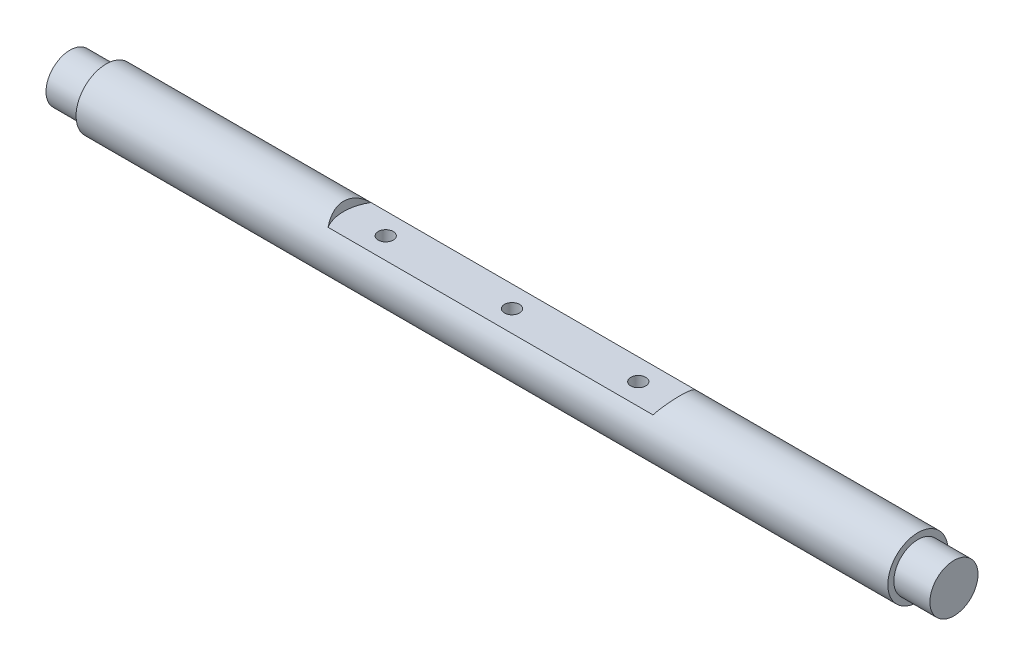
ISO-10303-21;
HEADER;
FILE_DESCRIPTION(('STEP AP214'),'2;1');
FILE_NAME('part.step','',(''),(''),'','','');
FILE_SCHEMA(('AUTOMOTIVE_DESIGN { 1 0 10303 214 1 1 1 1 }'));
ENDSEC;
DATA;
#1=APPLICATION_CONTEXT('core data for automotive mechanical design processes');
#2=APPLICATION_PROTOCOL_DEFINITION('international standard','automotive_design',2000,#1);
#3=PRODUCT_CONTEXT('',#1,'mechanical');
#4=PRODUCT('Part','Part','',(#3));
#5=PRODUCT_RELATED_PRODUCT_CATEGORY('part','',(#4));
#6=PRODUCT_DEFINITION_FORMATION('','',#4);
#7=PRODUCT_DEFINITION_CONTEXT('part definition',#1,'design');
#8=PRODUCT_DEFINITION('design','',#6,#7);
#9=PRODUCT_DEFINITION_SHAPE('','',#8);
#10=(LENGTH_UNIT() NAMED_UNIT(*) SI_UNIT(.MILLI.,.METRE.));
#11=(NAMED_UNIT(*) PLANE_ANGLE_UNIT() SI_UNIT($,.RADIAN.));
#12=(NAMED_UNIT(*) SI_UNIT($,.STERADIAN.) SOLID_ANGLE_UNIT());
#13=UNCERTAINTY_MEASURE_WITH_UNIT(LENGTH_MEASURE(1.E-05),#10,'distance_accuracy_value','');
#14=(GEOMETRIC_REPRESENTATION_CONTEXT(3) GLOBAL_UNCERTAINTY_ASSIGNED_CONTEXT((#13)) GLOBAL_UNIT_ASSIGNED_CONTEXT((#10,
#11,#12)) REPRESENTATION_CONTEXT('',''));
#15=CARTESIAN_POINT('',(0.,0.,0.));
#16=DIRECTION('',(0.,0.,1.));
#17=DIRECTION('',(1.,0.,0.));
#18=AXIS2_PLACEMENT_3D('',#15,#16,#17);
#19=CARTESIAN_POINT('',(-73.5,0.,0.));
#20=DIRECTION('',(1.,0.,0.));
#21=DIRECTION('',(0.,1.,0.));
#22=AXIS2_PLACEMENT_3D('',#19,#20,#21);
#23=CYLINDRICAL_SURFACE('',#22,4.99999999999999);
#24=CARTESIAN_POINT('',(67.5,0.,0.));
#25=DIRECTION('',(1.,0.,0.));
#26=DIRECTION('',(0.,1.,0.));
#27=AXIS2_PLACEMENT_3D('',#24,#25,#26);
#28=CIRCLE('',#27,4.99999999999998);
#29=CARTESIAN_POINT('',(67.5,5.,0.));
#30=VERTEX_POINT('',#29);
#31=EDGE_CURVE('E90',#30,#30,#28,.T.);
#32=ORIENTED_EDGE('',*,*,#31,.F.);
#33=EDGE_LOOP('',(#32));
#34=FACE_BOUND('',#33,.T.);
#35=CARTESIAN_POINT('',(-67.5,0.,0.));
#36=DIRECTION('',(1.,0.,0.));
#37=DIRECTION('',(0.,1.,0.));
#38=AXIS2_PLACEMENT_3D('',#35,#36,#37);
#39=CIRCLE('',#38,5.);
#40=CARTESIAN_POINT('',(-67.5,5.,0.));
#41=VERTEX_POINT('',#40);
#42=EDGE_CURVE('E93',#41,#41,#39,.T.);
#43=ORIENTED_EDGE('',*,*,#42,.T.);
#44=EDGE_LOOP('',(#43));
#45=FACE_BOUND('',#44,.T.);
#46=CARTESIAN_POINT('',(-21.,-4.84122918275926,1.25));
#47=CARTESIAN_POINT('',(-21.0690253754623,-4.84123050042653,1.24999803929589));
#48=CARTESIAN_POINT('',(-21.138072449339,-4.84272153006955,1.24426312274865));
#49=CARTESIAN_POINT('',(-21.274183789087,-4.84850930996623,1.22151156273207));
#50=CARTESIAN_POINT('',(-21.3412468772342,-4.85280769310905,1.2044883533711));
#51=CARTESIAN_POINT('',(-21.4714017690935,-4.86369362297982,1.15974559981597));
#52=CARTESIAN_POINT('',(-21.5344985776928,-4.87027821345203,1.13203986392723));
#53=CARTESIAN_POINT('',(-21.65515542627,-4.88499096014402,1.0667605706307));
#54=CARTESIAN_POINT('',(-21.7127152310401,-4.89311918189249,1.02918659428034));
#55=CARTESIAN_POINT('',(-21.8219308226311,-4.91020358177804,0.944354213655933));
#56=CARTESIAN_POINT('',(-21.873446800175,-4.91917298811514,0.896918443852021));
#57=CARTESIAN_POINT('',(-21.9678806971802,-4.93681437757647,0.794091032050329));
#58=CARTESIAN_POINT('',(-22.0107978128109,-4.94548633283193,0.73869864709015));
#59=CARTESIAN_POINT('',(-22.0873877338156,-4.96170207760289,0.620572600539473));
#60=CARTESIAN_POINT('',(-22.1209231940807,-4.96922843700295,0.557747288097556));
#61=CARTESIAN_POINT('',(-22.1769048220765,-4.9821540596299,0.427131592146378));
#62=CARTESIAN_POINT('',(-22.1993526259578,-4.98755363667171,0.359341942895967));
#63=CARTESIAN_POINT('',(-22.2320739172893,-4.99552379424088,0.222179379377078));
#64=CARTESIAN_POINT('',(-22.2425848221633,-4.99814946922155,0.152866359774485));
#65=CARTESIAN_POINT('',(-22.2518791896378,-5.00046797053647,0.0134144096313823));
#66=CARTESIAN_POINT('',(-22.2506643861048,-5.0001612304835,-0.0567243972690367));
#67=CARTESIAN_POINT('',(-22.2367125748749,-4.99669047476766,-0.194190308965486));
#68=CARTESIAN_POINT('',(-22.2242318374731,-4.99359001170435,-0.261545269501336));
#69=CARTESIAN_POINT('',(-22.1885143649757,-4.98495418262425,-0.39317280926711));
#70=CARTESIAN_POINT('',(-22.1652770573113,-4.97941868699219,-0.457445224213049));
#71=CARTESIAN_POINT('',(-22.1084987146565,-4.96643754850446,-0.58175837937726));
#72=CARTESIAN_POINT('',(-22.0748664776691,-4.95897509847525,-0.641755637208133));
#73=CARTESIAN_POINT('',(-21.9983221604419,-4.94294951904823,-0.755344527925614));
#74=CARTESIAN_POINT('',(-21.9554084657197,-4.93438619826243,-0.808935043856884));
#75=CARTESIAN_POINT('',(-21.8601456290088,-4.91681856884759,-0.909717543856196));
#76=CARTESIAN_POINT('',(-21.8075725538261,-4.90780859762957,-0.956697098843999));
#77=CARTESIAN_POINT('',(-21.6952000132299,-4.89057521758352,-1.04122046995377));
#78=CARTESIAN_POINT('',(-21.6354002102545,-4.88235184552984,-1.07876384505752));
#79=CARTESIAN_POINT('',(-21.5098549829255,-4.86760248415823,-1.14348516127825));
#80=CARTESIAN_POINT('',(-21.4440821348434,-4.86108491862859,-1.17061195871311));
#81=CARTESIAN_POINT('',(-21.3087072659618,-4.85059320069977,-1.21335702579542));
#82=CARTESIAN_POINT('',(-21.2391060680084,-4.84661850405108,-1.22897775819114));
#83=CARTESIAN_POINT('',(-21.1000202492384,-4.84177678019569,-1.24791481933259));
#84=CARTESIAN_POINT('',(-21.0305811033352,-4.84083044546822,-1.25154523695981));
#85=CARTESIAN_POINT('',(-20.8920890317109,-4.84193671740518,-1.24725849525777));
#86=CARTESIAN_POINT('',(-20.8230360710244,-4.84398904800631,-1.2393423989244));
#87=CARTESIAN_POINT('',(-20.6884428675226,-4.85078540977279,-1.21246273196883));
#88=CARTESIAN_POINT('',(-20.6228636367146,-4.85548485117186,-1.19368203414087));
#89=CARTESIAN_POINT('',(-20.4957842710742,-4.8670035913548,-1.14580904083531));
#90=CARTESIAN_POINT('',(-20.4342846204723,-4.87382314124305,-1.11671552385627));
#91=CARTESIAN_POINT('',(-20.3157793610663,-4.8889806854663,-1.04838533396827));
#92=CARTESIAN_POINT('',(-20.2588855799785,-4.89734584303319,-1.00896087691781));
#93=CARTESIAN_POINT('',(-20.1524058185993,-4.91458541535856,-0.921325366168066));
#94=CARTESIAN_POINT('',(-20.102821041675,-4.92345991364233,-0.873112868506796));
#95=CARTESIAN_POINT('',(-20.0110944787145,-4.94098701515801,-0.767828401230903));
#96=CARTESIAN_POINT('',(-19.9691699687256,-4.94962851030916,-0.710564940664485));
#97=CARTESIAN_POINT('',(-19.8955320665244,-4.96548608306865,-0.589628353368338));
#98=CARTESIAN_POINT('',(-19.8638181416959,-4.97270223501978,-0.525955561196984));
#99=CARTESIAN_POINT('',(-19.811776982736,-4.98485057869155,-0.394447752163859));
#100=CARTESIAN_POINT('',(-19.7913678578105,-4.98979915011203,-0.326646726284848));
#101=CARTESIAN_POINT('',(-19.7622698326958,-4.99692646697892,-0.188437200398506));
#102=CARTESIAN_POINT('',(-19.7535786706305,-4.99910574696703,-0.118029206301551));
#103=CARTESIAN_POINT('',(-19.7482905130306,-5.00042711761012,0.021354408054161));
#104=CARTESIAN_POINT('',(-19.7513728636308,-4.99964973600009,0.0903172837075443));
#105=CARTESIAN_POINT('',(-19.7688097841179,-4.99532370571778,0.226709370518427));
#106=CARTESIAN_POINT('',(-19.7831640187664,-4.99177513946367,0.294138627226111));
#107=CARTESIAN_POINT('',(-19.8225652747137,-4.98231791067452,0.425213794556022));
#108=CARTESIAN_POINT('',(-19.8475543166433,-4.97642205628331,0.488878118226276));
#109=CARTESIAN_POINT('',(-19.9074632237742,-4.96289111141729,0.611146316301837));
#110=CARTESIAN_POINT('',(-19.942384340837,-4.95525580172168,0.669749551581316));
#111=CARTESIAN_POINT('',(-20.0221440424963,-4.93884062101664,0.781752410529876));
#112=CARTESIAN_POINT('',(-20.0672001786342,-4.93003771182012,0.834993735375732));
#113=CARTESIAN_POINT('',(-20.1655285649673,-4.91238311316551,0.93326877533907));
#114=CARTESIAN_POINT('',(-20.2188028951224,-4.90353141190693,0.978300406335238));
#115=CARTESIAN_POINT('',(-20.3332517677517,-4.88659344825683,1.05970253309904));
#116=CARTESIAN_POINT('',(-20.3945551542658,-4.87852454662354,1.09589577430819));
#117=CARTESIAN_POINT('',(-20.5225693624034,-4.86429944438268,1.15740862076958));
#118=CARTESIAN_POINT('',(-20.5892762076334,-4.85814185308377,1.18273613719965));
#119=CARTESIAN_POINT('',(-20.7132212647834,-4.84939885924727,1.2180281607068));
#120=CARTESIAN_POINT('',(-20.7698664554798,-4.84635828750682,1.22999146324422));
#121=CARTESIAN_POINT('',(-20.88433608625,-4.84227298231963,1.24597786571658));
#122=CARTESIAN_POINT('',(-20.9421604253063,-4.84122807862452,1.25000164296523));
#123=CARTESIAN_POINT('',(-21.,-4.84122918275926,1.25));
#124=B_SPLINE_CURVE_WITH_KNOTS('',3,(#46,#47,#48,#49,#50,#51,#52,#53,#54,#55,#56,#57,#58,#59,
#60,#61,#62,#63,#64,#65,#66,#67,#68,#69,#70,#71,#72,#73,#74,#75,#76,#77,#78,#79,#80,#81,#82,#83,
#84,#85,#86,#87,#88,#89,#90,#91,#92,#93,#94,#95,#96,#97,#98,#99,#100,#101,#102,#103,#104,#105,
#106,#107,#108,#109,#110,#111,#112,#113,#114,#115,#116,#117,#118,#119,#120,#121,#122,#123),
.UNSPECIFIED.,.T.,.F.,(4,2,2,2,2,2,2,2,2,2,2,2,2,2,2,2,2,2,2,2,2,2,2,2,2,2,2,2,2,2,2,2,2,2,2,2,
2,2,4),(0.,0.206863720868071,0.413847870714335,0.620565363583015,0.827291633777397,
1.03811977096488,1.24896760739933,1.4627574819896,1.67651579923546,1.88594375497673,
2.0953407433301,2.30009131344473,2.50485278362393,2.71146437127222,2.91811192734457,
3.13035233285956,3.34260265599901,3.55588216004201,3.76911600064773,3.97671787380858,
4.18430063591901,4.38848702504603,4.59269760710708,4.80091422929578,5.00916509442522,
5.22262665482659,5.43607707859776,5.64796036403464,5.85980274454518,6.06591723063728,
6.2720255868849,6.47702438279855,6.68204902869035,6.89198548291035,7.10197515782753,
7.31588238642337,7.52963360683309,7.70298913588664,7.87632987549759),.UNSPECIFIED.);
#125=CARTESIAN_POINT('',(-21.,-4.84122918275926,1.25));
#126=VERTEX_POINT('',#125);
#127=EDGE_CURVE('E96',#126,#126,#124,.T.);
#128=ORIENTED_EDGE('',*,*,#127,.F.);
#129=EDGE_LOOP('',(#128));
#130=FACE_BOUND('',#129,.T.);
#131=CARTESIAN_POINT('',(21.,-4.84122918275925,1.25));
#132=CARTESIAN_POINT('',(20.9309746245377,-4.84123050042652,1.24999803929589));
#133=CARTESIAN_POINT('',(20.861927550661,-4.84272153006955,1.24426312274865));
#134=CARTESIAN_POINT('',(20.725816210913,-4.84850930996622,1.22151156273207));
#135=CARTESIAN_POINT('',(20.6587531227658,-4.85280769310905,1.2044883533711));
#136=CARTESIAN_POINT('',(20.5285982309065,-4.86369362297981,1.15974559981597));
#137=CARTESIAN_POINT('',(20.4655014223072,-4.87027821345202,1.13203986392723));
#138=CARTESIAN_POINT('',(20.34484457373,-4.88499096014402,1.0667605706307));
#139=CARTESIAN_POINT('',(20.2872847689599,-4.89311918189249,1.02918659428034));
#140=CARTESIAN_POINT('',(20.1780691773689,-4.91020358177803,0.944354213655932));
#141=CARTESIAN_POINT('',(20.126553199825,-4.91917298811513,0.896918443852019));
#142=CARTESIAN_POINT('',(20.0321193028198,-4.93681437757647,0.794091032050327));
#143=CARTESIAN_POINT('',(19.9892021871891,-4.94548633283193,0.738698647090149));
#144=CARTESIAN_POINT('',(19.9126122661844,-4.96170207760289,0.620572600539473));
#145=CARTESIAN_POINT('',(19.8790768059193,-4.96922843700294,0.557747288097556));
#146=CARTESIAN_POINT('',(19.8230951779235,-4.9821540596299,0.427131592146378));
#147=CARTESIAN_POINT('',(19.8006473740422,-4.9875536366717,0.359341942895967));
#148=CARTESIAN_POINT('',(19.7679260827107,-4.99552379424088,0.222179379377078));
#149=CARTESIAN_POINT('',(19.7574151778367,-4.99814946922155,0.152866359774485));
#150=CARTESIAN_POINT('',(19.7481208103622,-5.00046797053647,0.0134144096313822));
#151=CARTESIAN_POINT('',(19.7493356138952,-5.0001612304835,-0.0567243972690368));
#152=CARTESIAN_POINT('',(19.7632874251251,-4.99669047476765,-0.194190308965487));
#153=CARTESIAN_POINT('',(19.7757681625269,-4.99359001170435,-0.261545269501336));
#154=CARTESIAN_POINT('',(19.8114856350243,-4.98495418262425,-0.39317280926711));
#155=CARTESIAN_POINT('',(19.8347229426887,-4.97941868699218,-0.45744522421305));
#156=CARTESIAN_POINT('',(19.8915012853435,-4.96643754850446,-0.581758379377259));
#157=CARTESIAN_POINT('',(19.9251335223309,-4.95897509847525,-0.641755637208131));
#158=CARTESIAN_POINT('',(20.0016778395581,-4.94294951904822,-0.755344527925611));
#159=CARTESIAN_POINT('',(20.0445915342803,-4.93438619826243,-0.808935043856883));
#160=CARTESIAN_POINT('',(20.1398543709912,-4.91681856884758,-0.909717543856197));
#161=CARTESIAN_POINT('',(20.1924274461739,-4.90780859762957,-0.956697098844));
#162=CARTESIAN_POINT('',(20.3047999867701,-4.89057521758351,-1.04122046995377));
#163=CARTESIAN_POINT('',(20.3645997897455,-4.88235184552983,-1.07876384505752));
#164=CARTESIAN_POINT('',(20.4901450170745,-4.86760248415822,-1.14348516127825));
#165=CARTESIAN_POINT('',(20.5559178651566,-4.86108491862858,-1.17061195871311));
#166=CARTESIAN_POINT('',(20.6912927340382,-4.85059320069976,-1.21335702579542));
#167=CARTESIAN_POINT('',(20.7608939319916,-4.84661850405107,-1.22897775819114));
#168=CARTESIAN_POINT('',(20.8999797507616,-4.84177678019568,-1.24791481933259));
#169=CARTESIAN_POINT('',(20.9694188966648,-4.84083044546822,-1.25154523695981));
#170=CARTESIAN_POINT('',(21.1079109682891,-4.84193671740517,-1.24725849525777));
#171=CARTESIAN_POINT('',(21.1769639289756,-4.84398904800631,-1.2393423989244));
#172=CARTESIAN_POINT('',(21.3115571324774,-4.85078540977278,-1.21246273196883));
#173=CARTESIAN_POINT('',(21.3771363632854,-4.85548485117185,-1.19368203414087));
#174=CARTESIAN_POINT('',(21.5042157289258,-4.86700359135479,-1.1458090408353));
#175=CARTESIAN_POINT('',(21.5657153795277,-4.87382314124305,-1.11671552385627));
#176=CARTESIAN_POINT('',(21.6842206389337,-4.88898068546629,-1.04838533396827));
#177=CARTESIAN_POINT('',(21.7411144200215,-4.89734584303319,-1.00896087691781));
#178=CARTESIAN_POINT('',(21.8475941814007,-4.91458541535856,-0.921325366168066));
#179=CARTESIAN_POINT('',(21.897178958325,-4.92345991364233,-0.873112868506796));
#180=CARTESIAN_POINT('',(21.9889055212855,-4.94098701515801,-0.767828401230904));
#181=CARTESIAN_POINT('',(22.0308300312744,-4.94962851030916,-0.710564940664486));
#182=CARTESIAN_POINT('',(22.1044679334756,-4.96548608306865,-0.589628353368339));
#183=CARTESIAN_POINT('',(22.1361818583041,-4.97270223501978,-0.525955561196984));
#184=CARTESIAN_POINT('',(22.188223017264,-4.98485057869155,-0.394447752163859));
#185=CARTESIAN_POINT('',(22.2086321421895,-4.98979915011203,-0.326646726284848));
#186=CARTESIAN_POINT('',(22.2377301673042,-4.99692646697892,-0.188437200398506));
#187=CARTESIAN_POINT('',(22.2464213293695,-4.99910574696702,-0.118029206301551));
#188=CARTESIAN_POINT('',(22.2517094869694,-5.00042711761012,0.0213544080541609));
#189=CARTESIAN_POINT('',(22.2486271363692,-4.99964973600008,0.0903172837075441));
#190=CARTESIAN_POINT('',(22.2311902158821,-4.99532370571777,0.226709370518427));
#191=CARTESIAN_POINT('',(22.2168359812336,-4.99177513946367,0.294138627226111));
#192=CARTESIAN_POINT('',(22.1774347252863,-4.98231791067451,0.425213794556023));
#193=CARTESIAN_POINT('',(22.1524456833567,-4.9764220562833,0.488878118226276));
#194=CARTESIAN_POINT('',(22.0925367762258,-4.96289111141728,0.611146316301837));
#195=CARTESIAN_POINT('',(22.057615659163,-4.95525580172168,0.669749551581317));
#196=CARTESIAN_POINT('',(21.9778559575037,-4.93884062101664,0.781752410529876));
#197=CARTESIAN_POINT('',(21.9327998213658,-4.93003771182012,0.834993735375732));
#198=CARTESIAN_POINT('',(21.8344714350328,-4.9123831131655,0.933268775339069));
#199=CARTESIAN_POINT('',(21.7811971048776,-4.90353141190693,0.978300406335238));
#200=CARTESIAN_POINT('',(21.6667482322483,-4.88659344825683,1.05970253309904));
#201=CARTESIAN_POINT('',(21.6054448457342,-4.87852454662354,1.09589577430819));
#202=CARTESIAN_POINT('',(21.4774306375966,-4.86429944438267,1.15740862076958));
#203=CARTESIAN_POINT('',(21.4107237923666,-4.85814185308376,1.18273613719965));
#204=CARTESIAN_POINT('',(21.2867787352166,-4.84939885924727,1.2180281607068));
#205=CARTESIAN_POINT('',(21.2301335445202,-4.84635828750681,1.22999146324422));
#206=CARTESIAN_POINT('',(21.11566391375,-4.84227298231963,1.24597786571658));
#207=CARTESIAN_POINT('',(21.0578395746937,-4.84122807862452,1.25000164296523));
#208=CARTESIAN_POINT('',(21.,-4.84122918275925,1.25));
#209=B_SPLINE_CURVE_WITH_KNOTS('',3,(#131,#132,#133,#134,#135,#136,#137,#138,#139,#140,#141,
#142,#143,#144,#145,#146,#147,#148,#149,#150,#151,#152,#153,#154,#155,#156,#157,#158,#159,#160,
#161,#162,#163,#164,#165,#166,#167,#168,#169,#170,#171,#172,#173,#174,#175,#176,#177,#178,#179,
#180,#181,#182,#183,#184,#185,#186,#187,#188,#189,#190,#191,#192,#193,#194,#195,#196,#197,#198,
#199,#200,#201,#202,#203,#204,#205,#206,#207,#208),.UNSPECIFIED.,.T.,.F.,(4,2,2,2,2,2,2,2,2,2,2,
2,2,2,2,2,2,2,2,2,2,2,2,2,2,2,2,2,2,2,2,2,2,2,2,2,2,2,4),(0.,0.206863720868071,
0.413847870714335,0.620565363583015,0.827291633777397,1.03811977096488,1.24896760739933,
1.4627574819896,1.67651579923546,1.88594375497673,2.0953407433301,2.30009131344473,
2.50485278362393,2.71146437127222,2.91811192734457,3.13035233285956,3.34260265599901,
3.555882160042,3.76911600064773,3.97671787380858,4.184300635919,4.38848702504603,
4.59269760710708,4.80091422929578,5.00916509442521,5.22262665482659,5.43607707859776,
5.64796036403464,5.85980274454518,6.06591723063727,6.2720255868849,6.47702438279854,
6.68204902869035,6.89198548291034,7.10197515782753,7.31588238642337,7.52963360683309,
7.70298913588664,7.87632987549759),.UNSPECIFIED.);
#210=CARTESIAN_POINT('',(21.,-4.84122918275925,1.25));
#211=VERTEX_POINT('',#210);
#212=EDGE_CURVE('E102',#211,#211,#209,.T.);
#213=ORIENTED_EDGE('',*,*,#212,.F.);
#214=EDGE_LOOP('',(#213));
#215=FACE_BOUND('',#214,.T.);
#216=CARTESIAN_POINT('',(0.,-4.84122918275925,1.25));
#217=CARTESIAN_POINT('',(-0.0690253754623048,-4.84123050042652,1.24999803929589));
#218=CARTESIAN_POINT('',(-0.138072449338997,-4.84272153006955,1.24426312274865));
#219=CARTESIAN_POINT('',(-0.274183789087019,-4.84850930996622,1.22151156273207));
#220=CARTESIAN_POINT('',(-0.341246877234164,-4.85280769310905,1.2044883533711));
#221=CARTESIAN_POINT('',(-0.471401769093521,-4.86369362297982,1.15974559981597));
#222=CARTESIAN_POINT('',(-0.534498577692835,-4.87027821345202,1.13203986392723));
#223=CARTESIAN_POINT('',(-0.655155426269961,-4.88499096014402,1.06676057063071));
#224=CARTESIAN_POINT('',(-0.712715231040114,-4.89311918189249,1.02918659428035));
#225=CARTESIAN_POINT('',(-0.821930822631103,-4.91020358177804,0.944354213655938));
#226=CARTESIAN_POINT('',(-0.873446800175023,-4.91917298811513,0.896918443852025));
#227=CARTESIAN_POINT('',(-0.967880697180172,-4.93681437757647,0.794091032050333));
#228=CARTESIAN_POINT('',(-1.01079781281087,-4.94548633283193,0.738698647090154));
#229=CARTESIAN_POINT('',(-1.08738773381564,-4.96170207760289,0.620572600539478));
#230=CARTESIAN_POINT('',(-1.12092319408073,-4.96922843700294,0.557747288097561));
#231=CARTESIAN_POINT('',(-1.17690482207654,-4.9821540596299,0.427131592146382));
#232=CARTESIAN_POINT('',(-1.19935262595776,-4.9875536366717,0.359341942895971));
#233=CARTESIAN_POINT('',(-1.23207391728929,-4.99552379424088,0.222179379377081));
#234=CARTESIAN_POINT('',(-1.24258482216329,-4.99814946922155,0.152866359774488));
#235=CARTESIAN_POINT('',(-1.25187918963778,-5.00046797053647,0.0134144096313849));
#236=CARTESIAN_POINT('',(-1.2506643861048,-5.0001612304835,-0.0567243972690341));
#237=CARTESIAN_POINT('',(-1.23671257487493,-4.99669047476765,-0.194190308965484));
#238=CARTESIAN_POINT('',(-1.22423183747307,-4.99359001170435,-0.261545269501334));
#239=CARTESIAN_POINT('',(-1.18851436497575,-4.98495418262425,-0.393172809267108));
#240=CARTESIAN_POINT('',(-1.1652770573113,-4.97941868699218,-0.457445224213048));
#241=CARTESIAN_POINT('',(-1.10849871465647,-4.96643754850446,-0.581758379377258));
#242=CARTESIAN_POINT('',(-1.07486647766913,-4.95897509847525,-0.641755637208131));
#243=CARTESIAN_POINT('',(-0.998322160441872,-4.94294951904823,-0.755344527925611));
#244=CARTESIAN_POINT('',(-0.955408465719691,-4.93438619826243,-0.808935043856882));
#245=CARTESIAN_POINT('',(-0.860145629008813,-4.91681856884758,-0.909717543856196));
#246=CARTESIAN_POINT('',(-0.807572553826114,-4.90780859762957,-0.956697098844));
#247=CARTESIAN_POINT('',(-0.695200013229875,-4.89057521758351,-1.04122046995377));
#248=CARTESIAN_POINT('',(-0.635400210254501,-4.88235184552983,-1.07876384505752));
#249=CARTESIAN_POINT('',(-0.509854982925518,-4.86760248415822,-1.14348516127825));
#250=CARTESIAN_POINT('',(-0.444082134843403,-4.86108491862858,-1.17061195871311));
#251=CARTESIAN_POINT('',(-0.308707265961775,-4.85059320069977,-1.21335702579543));
#252=CARTESIAN_POINT('',(-0.239106068008433,-4.84661850405107,-1.22897775819114));
#253=CARTESIAN_POINT('',(-0.10002024923844,-4.84177678019568,-1.24791481933259));
#254=CARTESIAN_POINT('',(-0.0305811033351861,-4.84083044546822,-1.25154523695981));
#255=CARTESIAN_POINT('',(0.107910968289079,-4.84193671740518,-1.24725849525777));
#256=CARTESIAN_POINT('',(0.17696392897562,-4.84398904800631,-1.2393423989244));
#257=CARTESIAN_POINT('',(0.311557132477353,-4.85078540977278,-1.21246273196883));
#258=CARTESIAN_POINT('',(0.377136363285422,-4.85548485117186,-1.19368203414087));
#259=CARTESIAN_POINT('',(0.504215728925841,-4.86700359135479,-1.14580904083531));
#260=CARTESIAN_POINT('',(0.56571537952767,-4.87382314124305,-1.11671552385627));
#261=CARTESIAN_POINT('',(0.684220638933675,-4.88898068546629,-1.04838533396828));
#262=CARTESIAN_POINT('',(0.741114420021552,-4.89734584303319,-1.00896087691782));
#263=CARTESIAN_POINT('',(0.847594181400677,-4.91458541535856,-0.921325366168071));
#264=CARTESIAN_POINT('',(0.897178958325038,-4.92345991364233,-0.8731128685068));
#265=CARTESIAN_POINT('',(0.988905521285479,-4.94098701515801,-0.767828401230908));
#266=CARTESIAN_POINT('',(1.03083003127441,-4.94962851030916,-0.710564940664491));
#267=CARTESIAN_POINT('',(1.10446793347562,-4.96548608306865,-0.589628353368345));
#268=CARTESIAN_POINT('',(1.1361818583041,-4.97270223501978,-0.525955561196989));
#269=CARTESIAN_POINT('',(1.18822301726397,-4.98485057869155,-0.394447752163863));
#270=CARTESIAN_POINT('',(1.20863214218953,-4.98979915011203,-0.326646726284852));
#271=CARTESIAN_POINT('',(1.23773016730421,-4.99692646697892,-0.18843720039851));
#272=CARTESIAN_POINT('',(1.24642132936953,-4.99910574696702,-0.118029206301555));
#273=CARTESIAN_POINT('',(1.25170948696942,-5.00042711761012,0.0213544080541576));
#274=CARTESIAN_POINT('',(1.24862713636924,-4.99964973600008,0.0903172837075409));
#275=CARTESIAN_POINT('',(1.23119021588209,-4.99532370571777,0.226709370518424));
#276=CARTESIAN_POINT('',(1.21683598123362,-4.99177513946367,0.294138627226108));
#277=CARTESIAN_POINT('',(1.17743472528634,-4.98231791067451,0.42521379455602));
#278=CARTESIAN_POINT('',(1.15244568335672,-4.97642205628331,0.488878118226274));
#279=CARTESIAN_POINT('',(1.09253677622584,-4.96289111141728,0.611146316301836));
#280=CARTESIAN_POINT('',(1.05761565916304,-4.95525580172168,0.669749551581315));
#281=CARTESIAN_POINT('',(0.977855957503659,-4.93884062101664,0.781752410529874));
#282=CARTESIAN_POINT('',(0.932799821365779,-4.93003771182012,0.83499373537573));
#283=CARTESIAN_POINT('',(0.834471435032753,-4.9123831131655,0.933268775339069));
#284=CARTESIAN_POINT('',(0.781197104877618,-4.90353141190693,0.978300406335237));
#285=CARTESIAN_POINT('',(0.666748232248335,-4.88659344825683,1.05970253309904));
#286=CARTESIAN_POINT('',(0.605444845734216,-4.87852454662354,1.09589577430819));
#287=CARTESIAN_POINT('',(0.477430637596624,-4.86429944438268,1.15740862076958));
#288=CARTESIAN_POINT('',(0.410723792366573,-4.85814185308376,1.18273613719965));
#289=CARTESIAN_POINT('',(0.286778735216605,-4.84939885924727,1.2180281607068));
#290=CARTESIAN_POINT('',(0.230133544520174,-4.84635828750681,1.22999146324422));
#291=CARTESIAN_POINT('',(0.115663913750046,-4.84227298231963,1.24597786571659));
#292=CARTESIAN_POINT('',(0.0578395746936731,-4.84122807862452,1.25000164296523));
#293=CARTESIAN_POINT('',(0.,-4.84122918275925,1.25));
#294=B_SPLINE_CURVE_WITH_KNOTS('',3,(#216,#217,#218,#219,#220,#221,#222,#223,#224,#225,#226,
#227,#228,#229,#230,#231,#232,#233,#234,#235,#236,#237,#238,#239,#240,#241,#242,#243,#244,#245,
#246,#247,#248,#249,#250,#251,#252,#253,#254,#255,#256,#257,#258,#259,#260,#261,#262,#263,#264,
#265,#266,#267,#268,#269,#270,#271,#272,#273,#274,#275,#276,#277,#278,#279,#280,#281,#282,#283,
#284,#285,#286,#287,#288,#289,#290,#291,#292,#293),.UNSPECIFIED.,.T.,.F.,(4,2,2,2,2,2,2,2,2,2,2,
2,2,2,2,2,2,2,2,2,2,2,2,2,2,2,2,2,2,2,2,2,2,2,2,2,2,2,4),(0.,0.206863720868068,
0.413847870714333,0.620565363583011,0.827291633777393,1.03811977096488,1.24896760739933,
1.4627574819896,1.67651579923546,1.88594375497673,2.0953407433301,2.30009131344474,
2.50485278362393,2.71146437127222,2.91811192734457,3.13035233285956,3.34260265599901,
3.55588216004202,3.76911600064774,3.97671787380859,4.18430063591901,4.38848702504604,
4.59269760710709,4.80091422929579,5.00916509442523,5.2226266548266,5.43607707859777,
5.64796036403465,5.8598027445452,6.06591723063729,6.27202558688491,6.47702438279856,
6.68204902869037,6.89198548291036,7.10197515782755,7.31588238642339,7.5296336068331,
7.70298913588666,7.87632987549761),.UNSPECIFIED.);
#295=CARTESIAN_POINT('',(0.,-4.84122918275925,1.25));
#296=VERTEX_POINT('',#295);
#297=EDGE_CURVE('E156',#296,#296,#294,.T.);
#298=ORIENTED_EDGE('',*,*,#297,.F.);
#299=EDGE_LOOP('',(#298));
#300=FACE_BOUND('',#299,.T.);
#301=CARTESIAN_POINT('',(27.0207972893962,3.5,-3.57071421427141));
#302=CARTESIAN_POINT('',(27.075891834909,3.59474359802478,-3.47783472172049));
#303=CARTESIAN_POINT('',(27.1304029373058,3.68599877866808,-3.38100291821917));
#304=CARTESIAN_POINT('',(27.2372452221234,3.86110139953646,-3.17958234213356));
#305=CARTESIAN_POINT('',(27.2895745830622,3.94494271306502,-3.07498728300384));
#306=CARTESIAN_POINT('',(27.3913967030515,4.10533881791921,-2.85737889808947));
#307=CARTESIAN_POINT('',(27.4408601505246,4.18182230263706,-2.74429907258068));
#308=CARTESIAN_POINT('',(27.5353721331809,4.32597437329179,-2.51092649085407));
#309=CARTESIAN_POINT('',(27.580421652185,4.39364492465626,-2.39063535164544));
#310=CARTESIAN_POINT('',(27.6653282870244,4.51982193788031,-2.14258746492534));
#311=CARTESIAN_POINT('',(27.705153292582,4.57827213799943,-2.0147909560175));
#312=CARTESIAN_POINT('',(27.7782753877949,4.68471058778699,-1.7531197414822));
#313=CARTESIAN_POINT('',(27.8115735575229,4.73270056857907,-1.61924604604209));
#314=CARTESIAN_POINT('',(27.870602036864,4.81726953653663,-1.34690825289577));
#315=CARTESIAN_POINT('',(27.8963615786248,4.85389263487169,-1.20846426680057));
#316=CARTESIAN_POINT('',(27.939703609124,4.91527825516765,-0.927723956688947));
#317=CARTESIAN_POINT('',(27.9572877822854,4.94004322036633,-0.785428432628554));
#318=CARTESIAN_POINT('',(27.9819385151782,4.97469498831647,-0.51777665369854));
#319=CARTESIAN_POINT('',(27.9901026519159,4.98613640450407,-0.392720144197685));
#320=CARTESIAN_POINT('',(27.9996878090094,4.9995652303528,-0.141847775453103));
#321=CARTESIAN_POINT('',(28.0011095349194,5.00155362921759,-0.0160319970421705));
#322=CARTESIAN_POINT('',(27.9971726344326,4.99604126616253,0.23534071311494));
#323=CARTESIAN_POINT('',(27.9918108538219,4.98853608989397,0.360897497235121));
#324=CARTESIAN_POINT('',(27.9744391389736,4.96415896527857,0.610627663901742));
#325=CARTESIAN_POINT('',(27.9624293745805,4.94728725623067,0.734801081708163));
#326=CARTESIAN_POINT('',(27.9333588814702,4.90628737346115,0.970244711216449));
#327=CARTESIAN_POINT('',(27.9168182016707,4.88290353070342,1.08170994236853));
#328=CARTESIAN_POINT('',(27.8787581558781,4.82883817890963,1.30199997636441));
#329=CARTESIAN_POINT('',(27.8572372367118,4.79815439317707,1.41082394376237));
#330=CARTESIAN_POINT('',(27.7857870419896,4.69567225664701,1.73239186390534));
#331=CARTESIAN_POINT('',(27.7289508877101,4.61341622071775,1.94038303286673));
#332=CARTESIAN_POINT('',(27.5953126820289,4.41631436338284,2.35663156459657));
#333=CARTESIAN_POINT('',(27.5172305323811,4.29930419032765,2.5634303324663));
#334=CARTESIAN_POINT('',(27.3492325252759,4.040112551968,2.95509559769565));
#335=CARTESIAN_POINT('',(27.2593232039723,3.89794497474846,3.13997410252117));
#336=CARTESIAN_POINT('',(27.1423959754991,3.70540103821575,3.35760926679443));
#337=CARTESIAN_POINT('',(27.1182707868904,3.66528478268111,3.401353543111));
#338=CARTESIAN_POINT('',(27.069735396484,3.58368029664056,3.48722434372401));
#339=CARTESIAN_POINT('',(27.0453257135958,3.54219436866336,3.52935334903837));
#340=CARTESIAN_POINT('',(27.0207972893961,3.50000000000013,3.57071421427152));
#341=B_SPLINE_CURVE_WITH_KNOTS('',3,(#301,#302,#303,#304,#305,#306,#307,#308,#309,#310,#311,
#312,#313,#314,#315,#316,#317,#318,#319,#320,#321,#322,#323,#324,#325,#326,#327,#328,#329,#330,
#331,#332,#333,#334,#335,#336,#337,#338,#339,#340),.UNSPECIFIED.,.F.,.F.,(4,2,2,2,2,2,2,2,2,2,2,
2,2,2,2,2,2,2,2,4),(0.,0.430930871765893,0.862214593043755,1.29732767312538,1.7323435491283,
2.16991894432804,2.60742186750748,3.0432051200942,3.47889854566221,3.85591135525325,
4.23288471176316,4.61003341883391,4.98717249084143,5.33204509535548,5.67702539960548,
6.36652678106813,7.11421150457025,7.86148475090824,8.0536746807034,8.24555650830149),.UNSPECIFIED.);
#342=CARTESIAN_POINT('',(27.0207972893962,3.5,-3.57071421427141));
#343=VERTEX_POINT('',#342);
#344=CARTESIAN_POINT('',(27.0207972893962,3.5,3.57071421427141));
#345=VERTEX_POINT('',#344);
#346=EDGE_CURVE('E45',#343,#345,#341,.T.);
#347=ORIENTED_EDGE('',*,*,#346,.T.);
#348=DIRECTION('',(1.,0.,0.));
#349=VECTOR('',#348,1.);
#350=CARTESIAN_POINT('',(-73.5,3.5,3.57071421427141));
#351=LINE('',#350,#349);
#352=CARTESIAN_POINT('',(-27.0207972893962,3.5,3.57071421427141));
#353=VERTEX_POINT('',#352);
#354=EDGE_CURVE('E57',#345,#353,#351,.F.);
#355=ORIENTED_EDGE('',*,*,#354,.T.);
#356=CARTESIAN_POINT('',(-27.0207972893962,3.5,3.57071421427141));
#357=CARTESIAN_POINT('',(-27.075891834909,3.59474359802478,3.47783472172049));
#358=CARTESIAN_POINT('',(-27.1304029373058,3.68599877866808,3.38100291821917));
#359=CARTESIAN_POINT('',(-27.2372452221234,3.86110139953645,3.17958234213356));
#360=CARTESIAN_POINT('',(-27.2895745830622,3.94494271306502,3.07498728300384));
#361=CARTESIAN_POINT('',(-27.3913967030515,4.10533881791921,2.85737889808947));
#362=CARTESIAN_POINT('',(-27.4408601505246,4.18182230263705,2.74429907258068));
#363=CARTESIAN_POINT('',(-27.5353721331809,4.32597437329178,2.51092649085407));
#364=CARTESIAN_POINT('',(-27.580421652185,4.39364492465625,2.39063535164544));
#365=CARTESIAN_POINT('',(-27.6653282870244,4.51982193788031,2.14258746492534));
#366=CARTESIAN_POINT('',(-27.705153292582,4.57827213799943,2.0147909560175));
#367=CARTESIAN_POINT('',(-27.7782753877949,4.68471058778698,1.75311974148219));
#368=CARTESIAN_POINT('',(-27.8115735575229,4.73270056857906,1.61924604604209));
#369=CARTESIAN_POINT('',(-27.870602036864,4.81726953653662,1.34690825289577));
#370=CARTESIAN_POINT('',(-27.8963615786248,4.85389263487169,1.20846426680056));
#371=CARTESIAN_POINT('',(-27.939703609124,4.91527825516765,0.927723956688944));
#372=CARTESIAN_POINT('',(-27.9572877822854,4.94004322036632,0.785428432628551));
#373=CARTESIAN_POINT('',(-27.9819385151782,4.97469498831647,0.517776653698539));
#374=CARTESIAN_POINT('',(-27.9901026519159,4.98613640450406,0.392720144197683));
#375=CARTESIAN_POINT('',(-27.9996878090094,4.99956523035279,0.141847775453101));
#376=CARTESIAN_POINT('',(-28.0011095349194,5.00155362921758,0.0160319970421689));
#377=CARTESIAN_POINT('',(-27.9971726344326,4.99604126616252,-0.235340713114941));
#378=CARTESIAN_POINT('',(-27.9918108538219,4.98853608989397,-0.360897497235122));
#379=CARTESIAN_POINT('',(-27.9744391389736,4.96415896527856,-0.610627663901743));
#380=CARTESIAN_POINT('',(-27.9624293745805,4.94728725623066,-0.734801081708163));
#381=CARTESIAN_POINT('',(-27.9333588814702,4.90628737346114,-0.97024471121645));
#382=CARTESIAN_POINT('',(-27.9168182016707,4.88290353070341,-1.08170994236853));
#383=CARTESIAN_POINT('',(-27.8787581558781,4.82883817890963,-1.30199997636442));
#384=CARTESIAN_POINT('',(-27.8572372367118,4.79815439317707,-1.41082394376237));
#385=CARTESIAN_POINT('',(-27.7857870419896,4.69567225664701,-1.73239186390534));
#386=CARTESIAN_POINT('',(-27.7289508877101,4.61341622071774,-1.94038303286673));
#387=CARTESIAN_POINT('',(-27.5953126820289,4.41631436338283,-2.35663156459657));
#388=CARTESIAN_POINT('',(-27.5172305323811,4.29930419032765,-2.5634303324663));
#389=CARTESIAN_POINT('',(-27.3492325252759,4.04011255196799,-2.95509559769565));
#390=CARTESIAN_POINT('',(-27.2593232039723,3.89794497474846,-3.13997410252118));
#391=CARTESIAN_POINT('',(-27.1423959754991,3.70540103821575,-3.35760926679443));
#392=CARTESIAN_POINT('',(-27.1182707868904,3.66528478268111,-3.401353543111));
#393=CARTESIAN_POINT('',(-27.069735396484,3.58368029664056,-3.48722434372401));
#394=CARTESIAN_POINT('',(-27.0453257135958,3.54219436866336,-3.52935334903837));
#395=CARTESIAN_POINT('',(-27.0207972893962,3.50000000000012,-3.57071421427152));
#396=B_SPLINE_CURVE_WITH_KNOTS('',3,(#356,#357,#358,#359,#360,#361,#362,#363,#364,#365,#366,
#367,#368,#369,#370,#371,#372,#373,#374,#375,#376,#377,#378,#379,#380,#381,#382,#383,#384,#385,
#386,#387,#388,#389,#390,#391,#392,#393,#394,#395),.UNSPECIFIED.,.F.,.F.,(4,2,2,2,2,2,2,2,2,2,2,
2,2,2,2,2,2,2,2,4),(0.,0.430930871765895,0.862214593043752,1.29732767312537,1.7323435491283,
2.16991894432804,2.60742186750748,3.0432051200942,3.47889854566221,3.85591135525325,
4.23288471176315,4.6100334188339,4.98717249084142,5.33204509535548,5.67702539960548,
6.36652678106813,7.11421150457024,7.86148475090823,8.05367468070339,8.24555650830148),.UNSPECIFIED.);
#397=CARTESIAN_POINT('',(-27.0207972893962,3.5,-3.57071421427141));
#398=VERTEX_POINT('',#397);
#399=EDGE_CURVE('E11',#353,#398,#396,.T.);
#400=ORIENTED_EDGE('',*,*,#399,.T.);
#401=DIRECTION('',(1.,0.,0.));
#402=VECTOR('',#401,1.);
#403=CARTESIAN_POINT('',(-73.5,3.5,-3.57071421427141));
#404=LINE('',#403,#402);
#405=EDGE_CURVE('E63',#398,#343,#404,.T.);
#406=ORIENTED_EDGE('',*,*,#405,.T.);
#407=EDGE_LOOP('',(#347,#355,#400,#406));
#408=FACE_BOUND('',#407,.T.);
#409=ADVANCED_FACE('F33',(#34,#45,#130,#215,#300,#408),#23,.T.);
#410=CARTESIAN_POINT('',(-21.,-5.,0.));
#411=DIRECTION('',(0.,1.,0.));
#412=DIRECTION('',(0.,0.,1.));
#413=AXIS2_PLACEMENT_3D('',#410,#411,#412);
#414=CYLINDRICAL_SURFACE('',#413,1.25);
#415=ORIENTED_EDGE('',*,*,#127,.T.);
#416=EDGE_LOOP('',(#415));
#417=FACE_BOUND('',#416,.T.);
#418=CARTESIAN_POINT('',(-21.,3.5,0.));
#419=DIRECTION('',(0.,1.,0.));
#420=DIRECTION('',(0.,0.,1.));
#421=AXIS2_PLACEMENT_3D('',#418,#419,#420);
#422=CIRCLE('',#421,1.25);
#423=CARTESIAN_POINT('',(-21.,3.5,1.25));
#424=VERTEX_POINT('',#423);
#425=EDGE_CURVE('E70',#424,#424,#422,.F.);
#426=ORIENTED_EDGE('',*,*,#425,.F.);
#427=EDGE_LOOP('',(#426));
#428=FACE_BOUND('',#427,.T.);
#429=ADVANCED_FACE('F109',(#417,#428),#414,.F.);
#430=CARTESIAN_POINT('',(21.,-5.,0.));
#431=DIRECTION('',(0.,1.,0.));
#432=DIRECTION('',(0.,0.,1.));
#433=AXIS2_PLACEMENT_3D('',#430,#431,#432);
#434=CYLINDRICAL_SURFACE('',#433,1.25);
#435=ORIENTED_EDGE('',*,*,#212,.T.);
#436=EDGE_LOOP('',(#435));
#437=FACE_BOUND('',#436,.T.);
#438=CARTESIAN_POINT('',(21.,3.5,0.));
#439=DIRECTION('',(0.,1.,0.));
#440=DIRECTION('',(0.,0.,1.));
#441=AXIS2_PLACEMENT_3D('',#438,#439,#440);
#442=CIRCLE('',#441,1.25);
#443=CARTESIAN_POINT('',(21.,3.5,1.25));
#444=VERTEX_POINT('',#443);
#445=EDGE_CURVE('E181',#444,#444,#442,.F.);
#446=ORIENTED_EDGE('',*,*,#445,.F.);
#447=EDGE_LOOP('',(#446));
#448=FACE_BOUND('',#447,.T.);
#449=ADVANCED_FACE('F113',(#437,#448),#434,.F.);
#450=CARTESIAN_POINT('',(0.,-5.,0.));
#451=DIRECTION('',(0.,1.,0.));
#452=DIRECTION('',(0.,0.,1.));
#453=AXIS2_PLACEMENT_3D('',#450,#451,#452);
#454=CYLINDRICAL_SURFACE('',#453,1.25);
#455=ORIENTED_EDGE('',*,*,#297,.T.);
#456=EDGE_LOOP('',(#455));
#457=FACE_BOUND('',#456,.T.);
#458=CARTESIAN_POINT('',(0.,3.5,0.));
#459=DIRECTION('',(0.,1.,0.));
#460=DIRECTION('',(0.,0.,1.));
#461=AXIS2_PLACEMENT_3D('',#458,#459,#460);
#462=CIRCLE('',#461,1.25);
#463=CARTESIAN_POINT('',(0.,3.5,1.25));
#464=VERTEX_POINT('',#463);
#465=EDGE_CURVE('E161',#464,#464,#462,.F.);
#466=ORIENTED_EDGE('',*,*,#465,.F.);
#467=EDGE_LOOP('',(#466));
#468=FACE_BOUND('',#467,.T.);
#469=ADVANCED_FACE('F138',(#457,#468),#454,.F.);
#470=CARTESIAN_POINT('',(-67.5,4.,0.));
#471=DIRECTION('',(-1.,0.,0.));
#472=DIRECTION('',(0.,-1.,0.));
#473=AXIS2_PLACEMENT_3D('',#470,#471,#472);
#474=PLANE('',#473);
#475=CARTESIAN_POINT('',(-67.5,0.,0.));
#476=DIRECTION('',(1.,0.,0.));
#477=DIRECTION('',(0.,1.,0.));
#478=AXIS2_PLACEMENT_3D('',#475,#476,#477);
#479=CIRCLE('',#478,4.);
#480=CARTESIAN_POINT('',(-67.5,4.,0.));
#481=VERTEX_POINT('',#480);
#482=EDGE_CURVE('E75',#481,#481,#479,.T.);
#483=ORIENTED_EDGE('',*,*,#482,.T.);
#484=EDGE_LOOP('',(#483));
#485=FACE_BOUND('',#484,.T.);
#486=ORIENTED_EDGE('',*,*,#42,.F.);
#487=EDGE_LOOP('',(#486));
#488=FACE_BOUND('',#487,.T.);
#489=ADVANCED_FACE('F35',(#485,#488),#474,.T.);
#490=CARTESIAN_POINT('',(67.5,5.,0.));
#491=DIRECTION('',(1.,0.,0.));
#492=DIRECTION('',(0.,1.,0.));
#493=AXIS2_PLACEMENT_3D('',#490,#491,#492);
#494=PLANE('',#493);
#495=ORIENTED_EDGE('',*,*,#31,.T.);
#496=EDGE_LOOP('',(#495));
#497=FACE_BOUND('',#496,.T.);
#498=CARTESIAN_POINT('',(67.5,0.,0.));
#499=DIRECTION('',(1.,0.,0.));
#500=DIRECTION('',(0.,1.,0.));
#501=AXIS2_PLACEMENT_3D('',#498,#499,#500);
#502=CIRCLE('',#501,3.99999999999998);
#503=CARTESIAN_POINT('',(67.5,4.,0.));
#504=VERTEX_POINT('',#503);
#505=EDGE_CURVE('E87',#504,#504,#502,.T.);
#506=ORIENTED_EDGE('',*,*,#505,.F.);
#507=EDGE_LOOP('',(#506));
#508=FACE_BOUND('',#507,.T.);
#509=ADVANCED_FACE('F131',(#497,#508),#494,.T.);
#510=CARTESIAN_POINT('',(-73.5,0.,0.));
#511=DIRECTION('',(1.,0.,0.));
#512=DIRECTION('',(0.,1.,0.));
#513=AXIS2_PLACEMENT_3D('',#510,#511,#512);
#514=CYLINDRICAL_SURFACE('',#513,3.99999999999998);
#515=ORIENTED_EDGE('',*,*,#505,.T.);
#516=EDGE_LOOP('',(#515));
#517=FACE_BOUND('',#516,.T.);
#518=CARTESIAN_POINT('',(73.5,0.,0.));
#519=DIRECTION('',(1.,0.,0.));
#520=DIRECTION('',(0.,1.,0.));
#521=AXIS2_PLACEMENT_3D('',#518,#519,#520);
#522=CIRCLE('',#521,3.99999999999998);
#523=CARTESIAN_POINT('',(73.5,4.,0.));
#524=VERTEX_POINT('',#523);
#525=EDGE_CURVE('E84',#524,#524,#522,.T.);
#526=ORIENTED_EDGE('',*,*,#525,.F.);
#527=EDGE_LOOP('',(#526));
#528=FACE_BOUND('',#527,.T.);
#529=ADVANCED_FACE('F128',(#517,#528),#514,.T.);
#530=CARTESIAN_POINT('',(73.5,4.,0.));
#531=DIRECTION('',(1.,0.,0.));
#532=DIRECTION('',(0.,1.,0.));
#533=AXIS2_PLACEMENT_3D('',#530,#531,#532);
#534=PLANE('',#533);
#535=ORIENTED_EDGE('',*,*,#525,.T.);
#536=EDGE_LOOP('',(#535));
#537=FACE_BOUND('',#536,.T.);
#538=ADVANCED_FACE('F124',(#537),#534,.T.);
#539=CARTESIAN_POINT('',(-73.5,0.,0.));
#540=DIRECTION('',(-1.,0.,0.));
#541=DIRECTION('',(0.,-1.,0.));
#542=AXIS2_PLACEMENT_3D('',#539,#540,#541);
#543=PLANE('',#542);
#544=CARTESIAN_POINT('',(-73.5,0.,0.));
#545=DIRECTION('',(1.,0.,0.));
#546=DIRECTION('',(0.,1.,0.));
#547=AXIS2_PLACEMENT_3D('',#544,#545,#546);
#548=CIRCLE('',#547,4.);
#549=CARTESIAN_POINT('',(-73.5,4.,0.));
#550=VERTEX_POINT('',#549);
#551=EDGE_CURVE('E78',#550,#550,#548,.T.);
#552=ORIENTED_EDGE('',*,*,#551,.F.);
#553=EDGE_LOOP('',(#552));
#554=FACE_BOUND('',#553,.T.);
#555=ADVANCED_FACE('F120',(#554),#543,.T.);
#556=CARTESIAN_POINT('',(-73.5,0.,0.));
#557=DIRECTION('',(1.,0.,0.));
#558=DIRECTION('',(0.,1.,0.));
#559=AXIS2_PLACEMENT_3D('',#556,#557,#558);
#560=CYLINDRICAL_SURFACE('',#559,4.);
#561=ORIENTED_EDGE('',*,*,#551,.T.);
#562=EDGE_LOOP('',(#561));
#563=FACE_BOUND('',#562,.T.);
#564=ORIENTED_EDGE('',*,*,#482,.F.);
#565=EDGE_LOOP('',(#564));
#566=FACE_BOUND('',#565,.T.);
#567=ADVANCED_FACE('F117',(#563,#566),#560,.T.);
#568=CARTESIAN_POINT('',(-21.,3.5,0.));
#569=DIRECTION('',(0.,1.,0.));
#570=DIRECTION('',(0.,0.,1.));
#571=AXIS2_PLACEMENT_3D('',#568,#569,#570);
#572=PLANE('',#571);
#573=ORIENTED_EDGE('',*,*,#445,.T.);
#574=EDGE_LOOP('',(#573));
#575=FACE_BOUND('',#574,.T.);
#576=CARTESIAN_POINT('',(21.,3.5,0.));
#577=DIRECTION('',(0.,1.,0.));
#578=DIRECTION('',(0.,0.,1.));
#579=AXIS2_PLACEMENT_3D('',#576,#577,#578);
#580=CIRCLE('',#579,7.);
#581=EDGE_CURVE('E52',#345,#343,#580,.T.);
#582=ORIENTED_EDGE('',*,*,#581,.T.);
#583=ORIENTED_EDGE('',*,*,#405,.F.);
#584=CARTESIAN_POINT('',(-21.,3.5,0.));
#585=DIRECTION('',(0.,1.,0.));
#586=DIRECTION('',(0.,0.,1.));
#587=AXIS2_PLACEMENT_3D('',#584,#585,#586);
#588=CIRCLE('',#587,7.);
#589=EDGE_CURVE('E67',#398,#353,#588,.T.);
#590=ORIENTED_EDGE('',*,*,#589,.T.);
#591=ORIENTED_EDGE('',*,*,#354,.F.);
#592=EDGE_LOOP('',(#582,#583,#590,#591));
#593=FACE_BOUND('',#592,.T.);
#594=ORIENTED_EDGE('',*,*,#465,.T.);
#595=EDGE_LOOP('',(#594));
#596=FACE_BOUND('',#595,.T.);
#597=ORIENTED_EDGE('',*,*,#425,.T.);
#598=EDGE_LOOP('',(#597));
#599=FACE_BOUND('',#598,.T.);
#600=ADVANCED_FACE('F65',(#575,#593,#596,#599),#572,.T.);
#601=CARTESIAN_POINT('',(-21.,13.5,0.));
#602=DIRECTION('',(0.,-1.,0.));
#603=DIRECTION('',(0.,0.,-1.));
#604=AXIS2_PLACEMENT_3D('',#601,#602,#603);
#605=CYLINDRICAL_SURFACE('',#604,7.);
#606=ORIENTED_EDGE('',*,*,#589,.F.);
#607=ORIENTED_EDGE('',*,*,#399,.F.);
#608=EDGE_LOOP('',(#606,#607));
#609=FACE_BOUND('',#608,.T.);
#610=ADVANCED_FACE('F73',(#609),#605,.F.);
#611=CARTESIAN_POINT('',(21.,13.5,0.));
#612=DIRECTION('',(0.,-1.,0.));
#613=DIRECTION('',(0.,0.,-1.));
#614=AXIS2_PLACEMENT_3D('',#611,#612,#613);
#615=CYLINDRICAL_SURFACE('',#614,7.);
#616=ORIENTED_EDGE('',*,*,#581,.F.);
#617=ORIENTED_EDGE('',*,*,#346,.F.);
#618=EDGE_LOOP('',(#616,#617));
#619=FACE_BOUND('',#618,.T.);
#620=ADVANCED_FACE('F167',(#619),#615,.F.);
#621=CLOSED_SHELL('',(#409,#429,#449,#469,#489,#509,#529,#538,#555,#567,#600,#610,#620));
#622=MANIFOLD_SOLID_BREP('B2',#621);
#623=ADVANCED_BREP_SHAPE_REPRESENTATION('',(#18,#622),#14);
#624=SHAPE_DEFINITION_REPRESENTATION(#9,#623);
ENDSEC;
END-ISO-10303-21;
